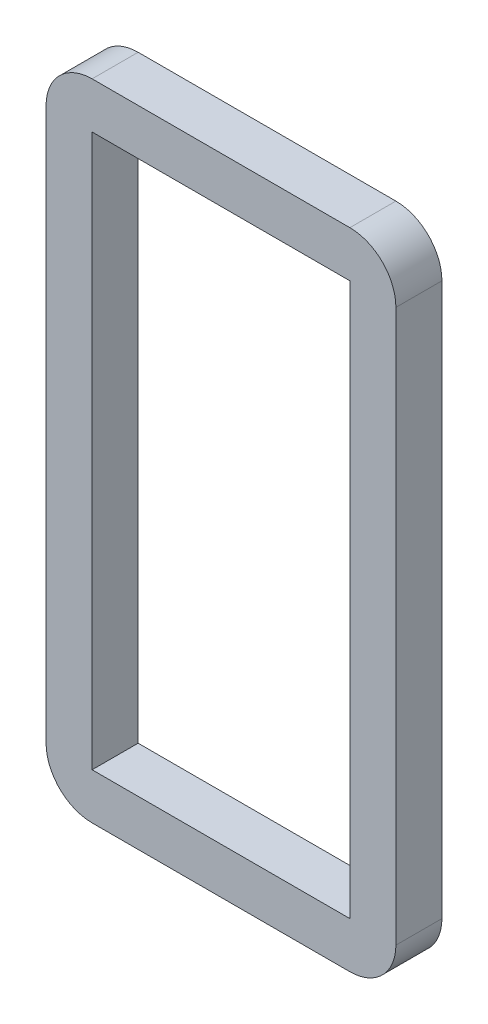
ISO-10303-21;
HEADER;
FILE_DESCRIPTION(('STEP AP214'),'2;1');
FILE_NAME('part.step','',(''),(''),'','','');
FILE_SCHEMA(('AUTOMOTIVE_DESIGN { 1 0 10303 214 1 1 1 1 }'));
ENDSEC;
DATA;
#1=APPLICATION_CONTEXT('core data for automotive mechanical design processes');
#2=APPLICATION_PROTOCOL_DEFINITION('international standard','automotive_design',2000,#1);
#3=PRODUCT_CONTEXT('',#1,'mechanical');
#4=PRODUCT('Part','Part','',(#3));
#5=PRODUCT_RELATED_PRODUCT_CATEGORY('part','',(#4));
#6=PRODUCT_DEFINITION_FORMATION('','',#4);
#7=PRODUCT_DEFINITION_CONTEXT('part definition',#1,'design');
#8=PRODUCT_DEFINITION('design','',#6,#7);
#9=PRODUCT_DEFINITION_SHAPE('','',#8);
#10=(LENGTH_UNIT() NAMED_UNIT(*) SI_UNIT(.MILLI.,.METRE.));
#11=(NAMED_UNIT(*) PLANE_ANGLE_UNIT() SI_UNIT($,.RADIAN.));
#12=(NAMED_UNIT(*) SI_UNIT($,.STERADIAN.) SOLID_ANGLE_UNIT());
#13=UNCERTAINTY_MEASURE_WITH_UNIT(LENGTH_MEASURE(1.E-05),#10,'distance_accuracy_value','');
#14=(GEOMETRIC_REPRESENTATION_CONTEXT(3) GLOBAL_UNCERTAINTY_ASSIGNED_CONTEXT((#13)) GLOBAL_UNIT_ASSIGNED_CONTEXT((#10,
#11,#12)) REPRESENTATION_CONTEXT('',''));
#15=CARTESIAN_POINT('',(0.,0.,0.));
#16=DIRECTION('',(0.,0.,1.));
#17=DIRECTION('',(1.,0.,0.));
#18=AXIS2_PLACEMENT_3D('',#15,#16,#17);
#19=CARTESIAN_POINT('',(-14.,-30.,2.5));
#20=DIRECTION('',(0.,0.,1.));
#21=DIRECTION('',(1.,0.,0.));
#22=AXIS2_PLACEMENT_3D('',#19,#20,#21);
#23=PLANE('',#22);
#24=CARTESIAN_POINT('',(-14.,-30.,2.5));
#25=DIRECTION('',(0.,0.,1.));
#26=DIRECTION('',(1.,0.,0.));
#27=AXIS2_PLACEMENT_3D('',#24,#25,#26);
#28=CIRCLE('',#27,5.);
#29=CARTESIAN_POINT('',(-19.,-30.,2.5));
#30=VERTEX_POINT('',#29);
#31=CARTESIAN_POINT('',(-14.,-35.,2.5));
#32=VERTEX_POINT('',#31);
#33=EDGE_CURVE('E177',#30,#32,#28,.T.);
#34=ORIENTED_EDGE('',*,*,#33,.T.);
#35=DIRECTION('',(1.,0.,0.));
#36=VECTOR('',#35,1.);
#37=CARTESIAN_POINT('',(-14.,-35.,2.5));
#38=LINE('',#37,#36);
#39=CARTESIAN_POINT('',(14.,-35.,2.5));
#40=VERTEX_POINT('',#39);
#41=EDGE_CURVE('E181',#32,#40,#38,.T.);
#42=ORIENTED_EDGE('',*,*,#41,.T.);
#43=CARTESIAN_POINT('',(14.,-30.,2.5));
#44=DIRECTION('',(0.,0.,1.));
#45=DIRECTION('',(-1.,0.,0.));
#46=AXIS2_PLACEMENT_3D('',#43,#44,#45);
#47=CIRCLE('',#46,5.);
#48=CARTESIAN_POINT('',(19.,-30.,2.5));
#49=VERTEX_POINT('',#48);
#50=EDGE_CURVE('E185',#40,#49,#47,.T.);
#51=ORIENTED_EDGE('',*,*,#50,.T.);
#52=DIRECTION('',(0.,1.,0.));
#53=VECTOR('',#52,1.);
#54=CARTESIAN_POINT('',(19.,30.,2.5));
#55=LINE('',#54,#53);
#56=CARTESIAN_POINT('',(19.,30.,2.5));
#57=VERTEX_POINT('',#56);
#58=EDGE_CURVE('E188',#49,#57,#55,.T.);
#59=ORIENTED_EDGE('',*,*,#58,.T.);
#60=CARTESIAN_POINT('',(14.,30.,2.5));
#61=DIRECTION('',(0.,0.,1.));
#62=DIRECTION('',(1.,0.,0.));
#63=AXIS2_PLACEMENT_3D('',#60,#61,#62);
#64=CIRCLE('',#63,5.);
#65=CARTESIAN_POINT('',(14.,35.,2.5));
#66=VERTEX_POINT('',#65);
#67=EDGE_CURVE('E191',#57,#66,#64,.T.);
#68=ORIENTED_EDGE('',*,*,#67,.T.);
#69=DIRECTION('',(-1.,0.,0.));
#70=VECTOR('',#69,1.);
#71=CARTESIAN_POINT('',(-14.,35.,2.5));
#72=LINE('',#71,#70);
#73=CARTESIAN_POINT('',(-14.,35.,2.5));
#74=VERTEX_POINT('',#73);
#75=EDGE_CURVE('E194',#66,#74,#72,.T.);
#76=ORIENTED_EDGE('',*,*,#75,.T.);
#77=CARTESIAN_POINT('',(-14.,30.,2.5));
#78=DIRECTION('',(0.,0.,1.));
#79=DIRECTION('',(1.,0.,0.));
#80=AXIS2_PLACEMENT_3D('',#77,#78,#79);
#81=CIRCLE('',#80,5.);
#82=CARTESIAN_POINT('',(-19.,30.,2.5));
#83=VERTEX_POINT('',#82);
#84=EDGE_CURVE('E197',#74,#83,#81,.T.);
#85=ORIENTED_EDGE('',*,*,#84,.T.);
#86=DIRECTION('',(0.,-1.,0.));
#87=VECTOR('',#86,1.);
#88=CARTESIAN_POINT('',(-19.,30.,2.5));
#89=LINE('',#88,#87);
#90=EDGE_CURVE('E200',#83,#30,#89,.T.);
#91=ORIENTED_EDGE('',*,*,#90,.T.);
#92=EDGE_LOOP('',(#34,#42,#51,#59,#68,#76,#85,#91));
#93=FACE_BOUND('',#92,.T.);
#94=DIRECTION('',(-1.,0.,0.));
#95=VECTOR('',#94,1.);
#96=CARTESIAN_POINT('',(-14.,30.,2.5));
#97=LINE('',#96,#95);
#98=CARTESIAN_POINT('',(14.,30.,2.5));
#99=VERTEX_POINT('',#98);
#100=CARTESIAN_POINT('',(-14.,30.,2.5));
#101=VERTEX_POINT('',#100);
#102=EDGE_CURVE('E138',#99,#101,#97,.T.);
#103=ORIENTED_EDGE('',*,*,#102,.F.);
#104=DIRECTION('',(0.,1.,0.));
#105=VECTOR('',#104,1.);
#106=CARTESIAN_POINT('',(14.,30.,2.5));
#107=LINE('',#106,#105);
#108=CARTESIAN_POINT('',(14.,-30.,2.5));
#109=VERTEX_POINT('',#108);
#110=EDGE_CURVE('E129',#109,#99,#107,.T.);
#111=ORIENTED_EDGE('',*,*,#110,.F.);
#112=DIRECTION('',(1.,0.,0.));
#113=VECTOR('',#112,1.);
#114=CARTESIAN_POINT('',(-14.,-30.,2.5));
#115=LINE('',#114,#113);
#116=CARTESIAN_POINT('',(-14.,-30.,2.5));
#117=VERTEX_POINT('',#116);
#118=EDGE_CURVE('E155',#117,#109,#115,.T.);
#119=ORIENTED_EDGE('',*,*,#118,.F.);
#120=DIRECTION('',(0.,-1.,0.));
#121=VECTOR('',#120,1.);
#122=CARTESIAN_POINT('',(-14.,30.,2.5));
#123=LINE('',#122,#121);
#124=EDGE_CURVE('E151',#101,#117,#123,.T.);
#125=ORIENTED_EDGE('',*,*,#124,.F.);
#126=EDGE_LOOP('',(#103,#111,#119,#125));
#127=FACE_BOUND('',#126,.T.);
#128=ADVANCED_FACE('F39',(#93,#127),#23,.T.);
#129=CARTESIAN_POINT('',(-14.,-30.,-2.5));
#130=DIRECTION('',(0.,0.,1.));
#131=DIRECTION('',(1.,0.,0.));
#132=AXIS2_PLACEMENT_3D('',#129,#130,#131);
#133=PLANE('',#132);
#134=CARTESIAN_POINT('',(-14.,-30.,-2.5));
#135=DIRECTION('',(0.,0.,1.));
#136=DIRECTION('',(1.,0.,0.));
#137=AXIS2_PLACEMENT_3D('',#134,#135,#136);
#138=CIRCLE('',#137,5.);
#139=CARTESIAN_POINT('',(-19.,-30.,-2.5));
#140=VERTEX_POINT('',#139);
#141=CARTESIAN_POINT('',(-14.,-35.,-2.5));
#142=VERTEX_POINT('',#141);
#143=EDGE_CURVE('E147',#140,#142,#138,.T.);
#144=ORIENTED_EDGE('',*,*,#143,.F.);
#145=DIRECTION('',(0.,-1.,0.));
#146=VECTOR('',#145,1.);
#147=CARTESIAN_POINT('',(-19.,30.,-2.5));
#148=LINE('',#147,#146);
#149=CARTESIAN_POINT('',(-19.,30.,-2.5));
#150=VERTEX_POINT('',#149);
#151=EDGE_CURVE('E182',#150,#140,#148,.T.);
#152=ORIENTED_EDGE('',*,*,#151,.F.);
#153=CARTESIAN_POINT('',(-14.,30.,-2.5));
#154=DIRECTION('',(0.,0.,1.));
#155=DIRECTION('',(1.,0.,0.));
#156=AXIS2_PLACEMENT_3D('',#153,#154,#155);
#157=CIRCLE('',#156,5.);
#158=CARTESIAN_POINT('',(-14.,35.,-2.5));
#159=VERTEX_POINT('',#158);
#160=EDGE_CURVE('E222',#159,#150,#157,.T.);
#161=ORIENTED_EDGE('',*,*,#160,.F.);
#162=DIRECTION('',(-1.,0.,0.));
#163=VECTOR('',#162,1.);
#164=CARTESIAN_POINT('',(-14.,35.,-2.5));
#165=LINE('',#164,#163);
#166=CARTESIAN_POINT('',(14.,35.,-2.5));
#167=VERTEX_POINT('',#166);
#168=EDGE_CURVE('E219',#167,#159,#165,.T.);
#169=ORIENTED_EDGE('',*,*,#168,.F.);
#170=CARTESIAN_POINT('',(14.,30.,-2.5));
#171=DIRECTION('',(0.,0.,1.));
#172=DIRECTION('',(1.,0.,0.));
#173=AXIS2_PLACEMENT_3D('',#170,#171,#172);
#174=CIRCLE('',#173,5.);
#175=CARTESIAN_POINT('',(19.,30.,-2.5));
#176=VERTEX_POINT('',#175);
#177=EDGE_CURVE('E216',#176,#167,#174,.T.);
#178=ORIENTED_EDGE('',*,*,#177,.F.);
#179=DIRECTION('',(0.,1.,0.));
#180=VECTOR('',#179,1.);
#181=CARTESIAN_POINT('',(19.,30.,-2.5));
#182=LINE('',#181,#180);
#183=CARTESIAN_POINT('',(19.,-30.,-2.5));
#184=VERTEX_POINT('',#183);
#185=EDGE_CURVE('E213',#184,#176,#182,.T.);
#186=ORIENTED_EDGE('',*,*,#185,.F.);
#187=CARTESIAN_POINT('',(14.,-30.,-2.5));
#188=DIRECTION('',(0.,0.,1.));
#189=DIRECTION('',(-1.,0.,0.));
#190=AXIS2_PLACEMENT_3D('',#187,#188,#189);
#191=CIRCLE('',#190,5.);
#192=CARTESIAN_POINT('',(14.,-35.,-2.5));
#193=VERTEX_POINT('',#192);
#194=EDGE_CURVE('E210',#193,#184,#191,.T.);
#195=ORIENTED_EDGE('',*,*,#194,.F.);
#196=DIRECTION('',(1.,0.,0.));
#197=VECTOR('',#196,1.);
#198=CARTESIAN_POINT('',(-14.,-35.,-2.5));
#199=LINE('',#198,#197);
#200=EDGE_CURVE('E207',#142,#193,#199,.T.);
#201=ORIENTED_EDGE('',*,*,#200,.F.);
#202=EDGE_LOOP('',(#144,#152,#161,#169,#178,#186,#195,#201));
#203=FACE_BOUND('',#202,.T.);
#204=DIRECTION('',(0.,1.,0.));
#205=VECTOR('',#204,1.);
#206=CARTESIAN_POINT('',(14.,30.,-2.5));
#207=LINE('',#206,#205);
#208=CARTESIAN_POINT('',(14.,-30.,-2.5));
#209=VERTEX_POINT('',#208);
#210=CARTESIAN_POINT('',(14.,30.,-2.5));
#211=VERTEX_POINT('',#210);
#212=EDGE_CURVE('E63',#209,#211,#207,.T.);
#213=ORIENTED_EDGE('',*,*,#212,.T.);
#214=DIRECTION('',(-1.,0.,0.));
#215=VECTOR('',#214,1.);
#216=CARTESIAN_POINT('',(-14.,30.,-2.5));
#217=LINE('',#216,#215);
#218=CARTESIAN_POINT('',(-14.,30.,-2.5));
#219=VERTEX_POINT('',#218);
#220=EDGE_CURVE('E145',#211,#219,#217,.T.);
#221=ORIENTED_EDGE('',*,*,#220,.T.);
#222=DIRECTION('',(0.,-1.,0.));
#223=VECTOR('',#222,1.);
#224=CARTESIAN_POINT('',(-14.,30.,-2.5));
#225=LINE('',#224,#223);
#226=CARTESIAN_POINT('',(-14.,-30.,-2.5));
#227=VERTEX_POINT('',#226);
#228=EDGE_CURVE('E164',#219,#227,#225,.T.);
#229=ORIENTED_EDGE('',*,*,#228,.T.);
#230=DIRECTION('',(1.,0.,0.));
#231=VECTOR('',#230,1.);
#232=CARTESIAN_POINT('',(-14.,-30.,-2.5));
#233=LINE('',#232,#231);
#234=EDGE_CURVE('E139',#227,#209,#233,.T.);
#235=ORIENTED_EDGE('',*,*,#234,.T.);
#236=EDGE_LOOP('',(#213,#221,#229,#235));
#237=FACE_BOUND('',#236,.T.);
#238=ADVANCED_FACE('F261',(#203,#237),#133,.F.);
#239=CARTESIAN_POINT('',(-14.,-30.,2.5));
#240=DIRECTION('',(0.,0.,-1.));
#241=DIRECTION('',(-1.,0.,0.));
#242=AXIS2_PLACEMENT_3D('',#239,#240,#241);
#243=CYLINDRICAL_SURFACE('',#242,5.);
#244=ORIENTED_EDGE('',*,*,#143,.T.);
#245=DIRECTION('',(0.,0.,-1.));
#246=VECTOR('',#245,1.);
#247=CARTESIAN_POINT('',(-14.,-35.,2.5));
#248=LINE('',#247,#246);
#249=EDGE_CURVE('E11',#32,#142,#248,.T.);
#250=ORIENTED_EDGE('',*,*,#249,.F.);
#251=ORIENTED_EDGE('',*,*,#33,.F.);
#252=DIRECTION('',(0.,0.,-1.));
#253=VECTOR('',#252,1.);
#254=CARTESIAN_POINT('',(-19.,-30.,2.5));
#255=LINE('',#254,#253);
#256=EDGE_CURVE('E203',#30,#140,#255,.T.);
#257=ORIENTED_EDGE('',*,*,#256,.T.);
#258=EDGE_LOOP('',(#244,#250,#251,#257));
#259=FACE_BOUND('',#258,.T.);
#260=ADVANCED_FACE('F41',(#259),#243,.T.);
#261=CARTESIAN_POINT('',(-14.,-35.,2.5));
#262=DIRECTION('',(0.,1.,0.));
#263=DIRECTION('',(0.,0.,1.));
#264=AXIS2_PLACEMENT_3D('',#261,#262,#263);
#265=PLANE('',#264);
#266=ORIENTED_EDGE('',*,*,#200,.T.);
#267=DIRECTION('',(0.,0.,-1.));
#268=VECTOR('',#267,1.);
#269=CARTESIAN_POINT('',(14.,-35.,2.5));
#270=LINE('',#269,#268);
#271=EDGE_CURVE('E48',#40,#193,#270,.T.);
#272=ORIENTED_EDGE('',*,*,#271,.F.);
#273=ORIENTED_EDGE('',*,*,#41,.F.);
#274=ORIENTED_EDGE('',*,*,#249,.T.);
#275=EDGE_LOOP('',(#266,#272,#273,#274));
#276=FACE_BOUND('',#275,.T.);
#277=ADVANCED_FACE('F278',(#276),#265,.F.);
#278=CARTESIAN_POINT('',(14.,-30.,2.5));
#279=DIRECTION('',(0.,0.,-1.));
#280=DIRECTION('',(-1.,0.,0.));
#281=AXIS2_PLACEMENT_3D('',#278,#279,#280);
#282=CYLINDRICAL_SURFACE('',#281,5.);
#283=ORIENTED_EDGE('',*,*,#194,.T.);
#284=DIRECTION('',(0.,0.,-1.));
#285=VECTOR('',#284,1.);
#286=CARTESIAN_POINT('',(19.,-30.,2.5));
#287=LINE('',#286,#285);
#288=EDGE_CURVE('E246',#49,#184,#287,.T.);
#289=ORIENTED_EDGE('',*,*,#288,.F.);
#290=ORIENTED_EDGE('',*,*,#50,.F.);
#291=ORIENTED_EDGE('',*,*,#271,.T.);
#292=EDGE_LOOP('',(#283,#289,#290,#291));
#293=FACE_BOUND('',#292,.T.);
#294=ADVANCED_FACE('F255',(#293),#282,.T.);
#295=CARTESIAN_POINT('',(19.,30.,2.5));
#296=DIRECTION('',(-1.,0.,0.));
#297=DIRECTION('',(0.,-1.,0.));
#298=AXIS2_PLACEMENT_3D('',#295,#296,#297);
#299=PLANE('',#298);
#300=ORIENTED_EDGE('',*,*,#185,.T.);
#301=DIRECTION('',(0.,0.,-1.));
#302=VECTOR('',#301,1.);
#303=CARTESIAN_POINT('',(19.,30.,2.5));
#304=LINE('',#303,#302);
#305=EDGE_CURVE('E242',#57,#176,#304,.T.);
#306=ORIENTED_EDGE('',*,*,#305,.F.);
#307=ORIENTED_EDGE('',*,*,#58,.F.);
#308=ORIENTED_EDGE('',*,*,#288,.T.);
#309=EDGE_LOOP('',(#300,#306,#307,#308));
#310=FACE_BOUND('',#309,.T.);
#311=ADVANCED_FACE('F267',(#310),#299,.F.);
#312=CARTESIAN_POINT('',(14.,30.,2.5));
#313=DIRECTION('',(0.,0.,-1.));
#314=DIRECTION('',(-1.,0.,0.));
#315=AXIS2_PLACEMENT_3D('',#312,#313,#314);
#316=CYLINDRICAL_SURFACE('',#315,5.);
#317=ORIENTED_EDGE('',*,*,#177,.T.);
#318=DIRECTION('',(0.,0.,-1.));
#319=VECTOR('',#318,1.);
#320=CARTESIAN_POINT('',(14.,35.,2.5));
#321=LINE('',#320,#319);
#322=EDGE_CURVE('E238',#66,#167,#321,.T.);
#323=ORIENTED_EDGE('',*,*,#322,.F.);
#324=ORIENTED_EDGE('',*,*,#67,.F.);
#325=ORIENTED_EDGE('',*,*,#305,.T.);
#326=EDGE_LOOP('',(#317,#323,#324,#325));
#327=FACE_BOUND('',#326,.T.);
#328=ADVANCED_FACE('F271',(#327),#316,.T.);
#329=CARTESIAN_POINT('',(-14.,35.,2.5));
#330=DIRECTION('',(0.,-1.,0.));
#331=DIRECTION('',(0.,0.,-1.));
#332=AXIS2_PLACEMENT_3D('',#329,#330,#331);
#333=PLANE('',#332);
#334=ORIENTED_EDGE('',*,*,#168,.T.);
#335=DIRECTION('',(0.,0.,-1.));
#336=VECTOR('',#335,1.);
#337=CARTESIAN_POINT('',(-14.,35.,2.5));
#338=LINE('',#337,#336);
#339=EDGE_CURVE('E234',#74,#159,#338,.T.);
#340=ORIENTED_EDGE('',*,*,#339,.F.);
#341=ORIENTED_EDGE('',*,*,#75,.F.);
#342=ORIENTED_EDGE('',*,*,#322,.T.);
#343=EDGE_LOOP('',(#334,#340,#341,#342));
#344=FACE_BOUND('',#343,.T.);
#345=ADVANCED_FACE('F291',(#344),#333,.F.);
#346=CARTESIAN_POINT('',(-14.,30.,2.5));
#347=DIRECTION('',(0.,0.,-1.));
#348=DIRECTION('',(-1.,0.,0.));
#349=AXIS2_PLACEMENT_3D('',#346,#347,#348);
#350=CYLINDRICAL_SURFACE('',#349,5.);
#351=ORIENTED_EDGE('',*,*,#160,.T.);
#352=DIRECTION('',(0.,0.,-1.));
#353=VECTOR('',#352,1.);
#354=CARTESIAN_POINT('',(-19.,30.,2.5));
#355=LINE('',#354,#353);
#356=EDGE_CURVE('E230',#83,#150,#355,.T.);
#357=ORIENTED_EDGE('',*,*,#356,.F.);
#358=ORIENTED_EDGE('',*,*,#84,.F.);
#359=ORIENTED_EDGE('',*,*,#339,.T.);
#360=EDGE_LOOP('',(#351,#357,#358,#359));
#361=FACE_BOUND('',#360,.T.);
#362=ADVANCED_FACE('F289',(#361),#350,.T.);
#363=CARTESIAN_POINT('',(-19.,30.,2.5));
#364=DIRECTION('',(1.,0.,0.));
#365=DIRECTION('',(0.,1.,0.));
#366=AXIS2_PLACEMENT_3D('',#363,#364,#365);
#367=PLANE('',#366);
#368=ORIENTED_EDGE('',*,*,#151,.T.);
#369=ORIENTED_EDGE('',*,*,#256,.F.);
#370=ORIENTED_EDGE('',*,*,#90,.F.);
#371=ORIENTED_EDGE('',*,*,#356,.T.);
#372=EDGE_LOOP('',(#368,#369,#370,#371));
#373=FACE_BOUND('',#372,.T.);
#374=ADVANCED_FACE('F284',(#373),#367,.F.);
#375=CARTESIAN_POINT('',(14.,30.,2.5));
#376=DIRECTION('',(-1.,0.,0.));
#377=DIRECTION('',(0.,-1.,0.));
#378=AXIS2_PLACEMENT_3D('',#375,#376,#377);
#379=PLANE('',#378);
#380=ORIENTED_EDGE('',*,*,#212,.F.);
#381=DIRECTION('',(0.,0.,-1.));
#382=VECTOR('',#381,1.);
#383=CARTESIAN_POINT('',(14.,-30.,2.5));
#384=LINE('',#383,#382);
#385=EDGE_CURVE('E133',#109,#209,#384,.T.);
#386=ORIENTED_EDGE('',*,*,#385,.F.);
#387=ORIENTED_EDGE('',*,*,#110,.T.);
#388=DIRECTION('',(0.,0.,-1.));
#389=VECTOR('',#388,1.);
#390=CARTESIAN_POINT('',(14.,30.,2.5));
#391=LINE('',#390,#389);
#392=EDGE_CURVE('E132',#99,#211,#391,.T.);
#393=ORIENTED_EDGE('',*,*,#392,.T.);
#394=EDGE_LOOP('',(#380,#386,#387,#393));
#395=FACE_BOUND('',#394,.T.);
#396=ADVANCED_FACE('F131',(#395),#379,.T.);
#397=CARTESIAN_POINT('',(-14.,30.,2.5));
#398=DIRECTION('',(0.,-1.,0.));
#399=DIRECTION('',(0.,0.,-1.));
#400=AXIS2_PLACEMENT_3D('',#397,#398,#399);
#401=PLANE('',#400);
#402=ORIENTED_EDGE('',*,*,#220,.F.);
#403=ORIENTED_EDGE('',*,*,#392,.F.);
#404=ORIENTED_EDGE('',*,*,#102,.T.);
#405=DIRECTION('',(0.,0.,-1.));
#406=VECTOR('',#405,1.);
#407=CARTESIAN_POINT('',(-14.,30.,2.5));
#408=LINE('',#407,#406);
#409=EDGE_CURVE('E148',#101,#219,#408,.T.);
#410=ORIENTED_EDGE('',*,*,#409,.T.);
#411=EDGE_LOOP('',(#402,#403,#404,#410));
#412=FACE_BOUND('',#411,.T.);
#413=ADVANCED_FACE('F142',(#412),#401,.T.);
#414=CARTESIAN_POINT('',(-14.,30.,2.5));
#415=DIRECTION('',(1.,0.,0.));
#416=DIRECTION('',(0.,1.,0.));
#417=AXIS2_PLACEMENT_3D('',#414,#415,#416);
#418=PLANE('',#417);
#419=ORIENTED_EDGE('',*,*,#228,.F.);
#420=ORIENTED_EDGE('',*,*,#409,.F.);
#421=ORIENTED_EDGE('',*,*,#124,.T.);
#422=DIRECTION('',(0.,0.,-1.));
#423=VECTOR('',#422,1.);
#424=CARTESIAN_POINT('',(-14.,-30.,2.5));
#425=LINE('',#424,#423);
#426=EDGE_CURVE('E55',#117,#227,#425,.T.);
#427=ORIENTED_EDGE('',*,*,#426,.T.);
#428=EDGE_LOOP('',(#419,#420,#421,#427));
#429=FACE_BOUND('',#428,.T.);
#430=ADVANCED_FACE('F316',(#429),#418,.T.);
#431=CARTESIAN_POINT('',(-14.,-30.,2.5));
#432=DIRECTION('',(0.,1.,0.));
#433=DIRECTION('',(0.,0.,1.));
#434=AXIS2_PLACEMENT_3D('',#431,#432,#433);
#435=PLANE('',#434);
#436=ORIENTED_EDGE('',*,*,#234,.F.);
#437=ORIENTED_EDGE('',*,*,#426,.F.);
#438=ORIENTED_EDGE('',*,*,#118,.T.);
#439=ORIENTED_EDGE('',*,*,#385,.T.);
#440=EDGE_LOOP('',(#436,#437,#438,#439));
#441=FACE_BOUND('',#440,.T.);
#442=ADVANCED_FACE('F320',(#441),#435,.T.);
#443=CLOSED_SHELL('',(#128,#238,#260,#277,#294,#311,#328,#345,#362,#374,#396,#413,#430,#442));
#444=MANIFOLD_SOLID_BREP('B2',#443);
#445=ADVANCED_BREP_SHAPE_REPRESENTATION('',(#18,#444),#14);
#446=SHAPE_DEFINITION_REPRESENTATION(#9,#445);
ENDSEC;
END-ISO-10303-21;
